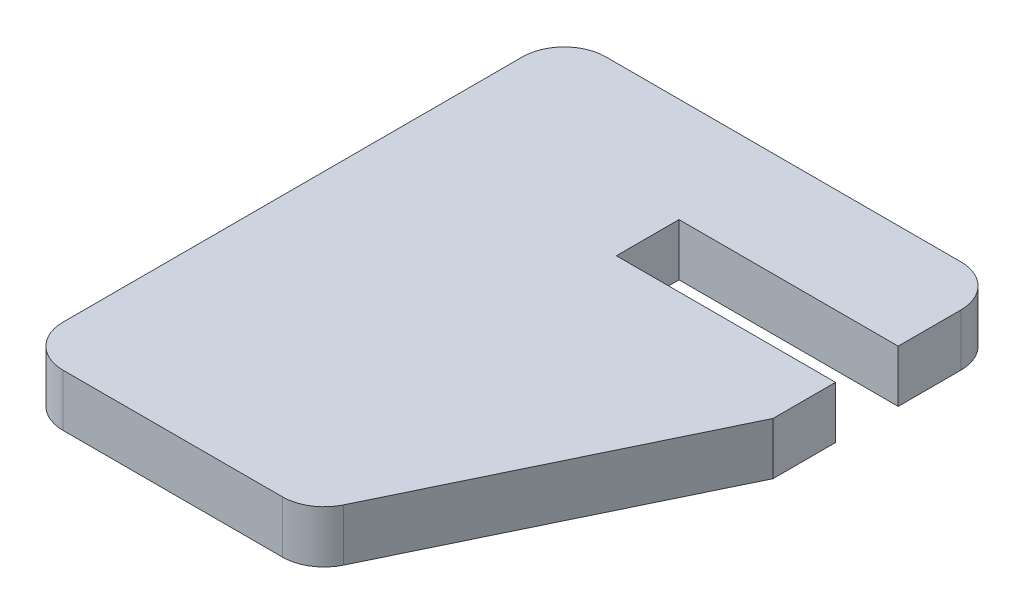
ISO-10303-21;
HEADER;
FILE_DESCRIPTION(('STEP AP214'),'2;1');
FILE_NAME('part.step','',(''),(''),'','','');
FILE_SCHEMA(('AUTOMOTIVE_DESIGN { 1 0 10303 214 1 1 1 1 }'));
ENDSEC;
DATA;
#1=APPLICATION_CONTEXT('core data for automotive mechanical design processes');
#2=APPLICATION_PROTOCOL_DEFINITION('international standard','automotive_design',2000,#1);
#3=PRODUCT_CONTEXT('',#1,'mechanical');
#4=PRODUCT('Part','Part','',(#3));
#5=PRODUCT_RELATED_PRODUCT_CATEGORY('part','',(#4));
#6=PRODUCT_DEFINITION_FORMATION('','',#4);
#7=PRODUCT_DEFINITION_CONTEXT('part definition',#1,'design');
#8=PRODUCT_DEFINITION('design','',#6,#7);
#9=PRODUCT_DEFINITION_SHAPE('','',#8);
#10=(LENGTH_UNIT() NAMED_UNIT(*) SI_UNIT(.MILLI.,.METRE.));
#11=(NAMED_UNIT(*) PLANE_ANGLE_UNIT() SI_UNIT($,.RADIAN.));
#12=(NAMED_UNIT(*) SI_UNIT($,.STERADIAN.) SOLID_ANGLE_UNIT());
#13=UNCERTAINTY_MEASURE_WITH_UNIT(LENGTH_MEASURE(1.E-05),#10,'distance_accuracy_value','');
#14=(GEOMETRIC_REPRESENTATION_CONTEXT(3) GLOBAL_UNCERTAINTY_ASSIGNED_CONTEXT((#13)) GLOBAL_UNIT_ASSIGNED_CONTEXT((#10,
#11,#12)) REPRESENTATION_CONTEXT('',''));
#15=CARTESIAN_POINT('',(0.,0.,0.));
#16=DIRECTION('',(0.,0.,1.));
#17=DIRECTION('',(1.,0.,0.));
#18=AXIS2_PLACEMENT_3D('',#15,#16,#17);
#19=CARTESIAN_POINT('',(5.07999999999999,6.35,40.6400000000009));
#20=DIRECTION('',(0.,-1.,0.));
#21=DIRECTION('',(0.,0.,-1.));
#22=AXIS2_PLACEMENT_3D('',#19,#20,#21);
#23=CYLINDRICAL_SURFACE('',#22,5.07999999999999);
#24=CARTESIAN_POINT('',(5.07999999999999,0.,40.6400000000009));
#25=DIRECTION('',(0.,1.,0.));
#26=DIRECTION('',(0.,0.,-1.));
#27=AXIS2_PLACEMENT_3D('',#24,#25,#26);
#28=CIRCLE('',#27,5.07999999999999);
#29=CARTESIAN_POINT('',(5.08000000000001,0.,45.7200000000008));
#30=VERTEX_POINT('',#29);
#31=CARTESIAN_POINT('',(9.65437909107353,0.,42.849401713395));
#32=VERTEX_POINT('',#31);
#33=EDGE_CURVE('E159',#30,#32,#28,.T.);
#34=ORIENTED_EDGE('',*,*,#33,.T.);
#35=DIRECTION('',(0.,-1.,0.));
#36=VECTOR('',#35,1.);
#37=CARTESIAN_POINT('',(9.65437909107353,6.35,42.849401713395));
#38=LINE('',#37,#36);
#39=CARTESIAN_POINT('',(9.65437909107353,6.35,42.849401713395));
#40=VERTEX_POINT('',#39);
#41=EDGE_CURVE('E11',#40,#32,#38,.T.);
#42=ORIENTED_EDGE('',*,*,#41,.F.);
#43=CARTESIAN_POINT('',(5.07999999999999,6.35,40.6400000000009));
#44=DIRECTION('',(0.,1.,0.));
#45=DIRECTION('',(0.,0.,-1.));
#46=AXIS2_PLACEMENT_3D('',#43,#44,#45);
#47=CIRCLE('',#46,5.07999999999999);
#48=CARTESIAN_POINT('',(5.08000000000001,6.35,45.7200000000008));
#49=VERTEX_POINT('',#48);
#50=EDGE_CURVE('E183',#49,#40,#47,.T.);
#51=ORIENTED_EDGE('',*,*,#50,.F.);
#52=DIRECTION('',(0.,-1.,0.));
#53=VECTOR('',#52,1.);
#54=CARTESIAN_POINT('',(5.08000000000001,6.35,45.7200000000008));
#55=LINE('',#54,#53);
#56=EDGE_CURVE('E155',#49,#30,#55,.T.);
#57=ORIENTED_EDGE('',*,*,#56,.T.);
#58=EDGE_LOOP('',(#34,#42,#51,#57));
#59=FACE_BOUND('',#58,.T.);
#60=ADVANCED_FACE('F33',(#59),#23,.T.);
#61=CARTESIAN_POINT('',(26.67,6.35,7.62));
#62=DIRECTION('',(-0.900468325014477,0.,-0.43492159712484));
#63=DIRECTION('',(-0.43492159712484,0.,0.900468325014478));
#64=AXIS2_PLACEMENT_3D('',#61,#62,#63);
#65=PLANE('',#64);
#66=DIRECTION('',(0.43492159712484,0.,-0.900468325014477));
#67=VECTOR('',#66,1.);
#68=CARTESIAN_POINT('',(26.67,0.,7.62));
#69=LINE('',#68,#67);
#70=CARTESIAN_POINT('',(26.67,0.,7.62));
#71=VERTEX_POINT('',#70);
#72=EDGE_CURVE('E162',#32,#71,#69,.T.);
#73=ORIENTED_EDGE('',*,*,#72,.T.);
#74=DIRECTION('',(0.,-1.,0.));
#75=VECTOR('',#74,1.);
#76=CARTESIAN_POINT('',(26.67,6.35,7.62));
#77=LINE('',#76,#75);
#78=CARTESIAN_POINT('',(26.67,6.35,7.62));
#79=VERTEX_POINT('',#78);
#80=EDGE_CURVE('E41',#79,#71,#77,.T.);
#81=ORIENTED_EDGE('',*,*,#80,.F.);
#82=DIRECTION('',(0.43492159712484,0.,-0.900468325014477));
#83=VECTOR('',#82,1.);
#84=CARTESIAN_POINT('',(26.67,6.35,7.62));
#85=LINE('',#84,#83);
#86=EDGE_CURVE('E107',#40,#79,#85,.T.);
#87=ORIENTED_EDGE('',*,*,#86,.F.);
#88=ORIENTED_EDGE('',*,*,#41,.T.);
#89=EDGE_LOOP('',(#73,#81,#87,#88));
#90=FACE_BOUND('',#89,.T.);
#91=ADVANCED_FACE('F266',(#90),#65,.F.);
#92=CARTESIAN_POINT('',(26.67,6.35,7.62));
#93=DIRECTION('',(-1.,0.,0.));
#94=DIRECTION('',(0.,0.,1.));
#95=AXIS2_PLACEMENT_3D('',#92,#93,#94);
#96=PLANE('',#95);
#97=DIRECTION('',(0.,0.,-1.));
#98=VECTOR('',#97,1.);
#99=CARTESIAN_POINT('',(26.67,0.,7.62));
#100=LINE('',#99,#98);
#101=CARTESIAN_POINT('',(26.67,0.,0.));
#102=VERTEX_POINT('',#101);
#103=EDGE_CURVE('E164',#71,#102,#100,.T.);
#104=ORIENTED_EDGE('',*,*,#103,.T.);
#105=DIRECTION('',(0.,-1.,0.));
#106=VECTOR('',#105,1.);
#107=CARTESIAN_POINT('',(26.67,6.35,0.));
#108=LINE('',#107,#106);
#109=CARTESIAN_POINT('',(26.67,6.35,0.));
#110=VERTEX_POINT('',#109);
#111=EDGE_CURVE('E205',#110,#102,#108,.T.);
#112=ORIENTED_EDGE('',*,*,#111,.F.);
#113=DIRECTION('',(0.,0.,-1.));
#114=VECTOR('',#113,1.);
#115=CARTESIAN_POINT('',(26.67,6.35,7.62));
#116=LINE('',#115,#114);
#117=EDGE_CURVE('E213',#79,#110,#116,.T.);
#118=ORIENTED_EDGE('',*,*,#117,.F.);
#119=ORIENTED_EDGE('',*,*,#80,.T.);
#120=EDGE_LOOP('',(#104,#112,#118,#119));
#121=FACE_BOUND('',#120,.T.);
#122=ADVANCED_FACE('F211',(#121),#96,.F.);
#123=CARTESIAN_POINT('',(26.67,6.35,0.));
#124=DIRECTION('',(0.,0.,1.));
#125=DIRECTION('',(1.,0.,0.));
#126=AXIS2_PLACEMENT_3D('',#123,#124,#125);
#127=PLANE('',#126);
#128=DIRECTION('',(-1.,0.,0.));
#129=VECTOR('',#128,1.);
#130=CARTESIAN_POINT('',(26.67,0.,0.));
#131=LINE('',#130,#129);
#132=CARTESIAN_POINT('',(0.,0.,0.));
#133=VERTEX_POINT('',#132);
#134=EDGE_CURVE('E166',#102,#133,#131,.T.);
#135=ORIENTED_EDGE('',*,*,#134,.T.);
#136=DIRECTION('',(0.,-1.,0.));
#137=VECTOR('',#136,1.);
#138=CARTESIAN_POINT('',(0.,6.35,0.));
#139=LINE('',#138,#137);
#140=CARTESIAN_POINT('',(0.,6.35,0.));
#141=VERTEX_POINT('',#140);
#142=EDGE_CURVE('E202',#141,#133,#139,.T.);
#143=ORIENTED_EDGE('',*,*,#142,.F.);
#144=DIRECTION('',(-1.,0.,0.));
#145=VECTOR('',#144,1.);
#146=CARTESIAN_POINT('',(26.67,6.35,0.));
#147=LINE('',#146,#145);
#148=EDGE_CURVE('E231',#110,#141,#147,.T.);
#149=ORIENTED_EDGE('',*,*,#148,.F.);
#150=ORIENTED_EDGE('',*,*,#111,.T.);
#151=EDGE_LOOP('',(#135,#143,#149,#150));
#152=FACE_BOUND('',#151,.T.);
#153=ADVANCED_FACE('F222',(#152),#127,.F.);
#154=CARTESIAN_POINT('',(0.,6.35,-7.62));
#155=DIRECTION('',(-1.,0.,0.));
#156=DIRECTION('',(0.,0.,1.));
#157=AXIS2_PLACEMENT_3D('',#154,#155,#156);
#158=PLANE('',#157);
#159=DIRECTION('',(0.,0.,-1.));
#160=VECTOR('',#159,1.);
#161=CARTESIAN_POINT('',(0.,0.,-7.62));
#162=LINE('',#161,#160);
#163=CARTESIAN_POINT('',(0.,0.,-7.62));
#164=VERTEX_POINT('',#163);
#165=EDGE_CURVE('E168',#133,#164,#162,.T.);
#166=ORIENTED_EDGE('',*,*,#165,.T.);
#167=DIRECTION('',(0.,-1.,0.));
#168=VECTOR('',#167,1.);
#169=CARTESIAN_POINT('',(0.,6.35,-7.62));
#170=LINE('',#169,#168);
#171=CARTESIAN_POINT('',(0.,6.35,-7.62));
#172=VERTEX_POINT('',#171);
#173=EDGE_CURVE('E199',#172,#164,#170,.T.);
#174=ORIENTED_EDGE('',*,*,#173,.F.);
#175=DIRECTION('',(0.,0.,-1.));
#176=VECTOR('',#175,1.);
#177=CARTESIAN_POINT('',(0.,6.35,-7.62));
#178=LINE('',#177,#176);
#179=EDGE_CURVE('E228',#141,#172,#178,.T.);
#180=ORIENTED_EDGE('',*,*,#179,.F.);
#181=ORIENTED_EDGE('',*,*,#142,.T.);
#182=EDGE_LOOP('',(#166,#174,#180,#181));
#183=FACE_BOUND('',#182,.T.);
#184=ADVANCED_FACE('F226',(#183),#158,.F.);
#185=CARTESIAN_POINT('',(26.67,6.35,-7.62));
#186=DIRECTION('',(0.,0.,-1.));
#187=DIRECTION('',(-1.,0.,0.));
#188=AXIS2_PLACEMENT_3D('',#185,#186,#187);
#189=PLANE('',#188);
#190=DIRECTION('',(1.,0.,0.));
#191=VECTOR('',#190,1.);
#192=CARTESIAN_POINT('',(26.67,0.,-7.62));
#193=LINE('',#192,#191);
#194=CARTESIAN_POINT('',(26.67,0.,-7.62));
#195=VERTEX_POINT('',#194);
#196=EDGE_CURVE('E170',#164,#195,#193,.T.);
#197=ORIENTED_EDGE('',*,*,#196,.T.);
#198=DIRECTION('',(0.,-1.,0.));
#199=VECTOR('',#198,1.);
#200=CARTESIAN_POINT('',(26.67,6.35,-7.62));
#201=LINE('',#200,#199);
#202=CARTESIAN_POINT('',(26.67,6.35,-7.62));
#203=VERTEX_POINT('',#202);
#204=EDGE_CURVE('E196',#203,#195,#201,.T.);
#205=ORIENTED_EDGE('',*,*,#204,.F.);
#206=DIRECTION('',(1.,0.,0.));
#207=VECTOR('',#206,1.);
#208=CARTESIAN_POINT('',(26.67,6.35,-7.62));
#209=LINE('',#208,#207);
#210=EDGE_CURVE('E230',#172,#203,#209,.T.);
#211=ORIENTED_EDGE('',*,*,#210,.F.);
#212=ORIENTED_EDGE('',*,*,#173,.T.);
#213=EDGE_LOOP('',(#197,#205,#211,#212));
#214=FACE_BOUND('',#213,.T.);
#215=ADVANCED_FACE('F279',(#214),#189,.F.);
#216=CARTESIAN_POINT('',(26.67,6.35,-7.62));
#217=DIRECTION('',(-1.,0.,0.));
#218=DIRECTION('',(0.,0.,1.));
#219=AXIS2_PLACEMENT_3D('',#216,#217,#218);
#220=PLANE('',#219);
#221=DIRECTION('',(0.,0.,-1.));
#222=VECTOR('',#221,1.);
#223=CARTESIAN_POINT('',(26.67,0.,-7.62));
#224=LINE('',#223,#222);
#225=CARTESIAN_POINT('',(26.67,0.,-15.24));
#226=VERTEX_POINT('',#225);
#227=EDGE_CURVE('E172',#195,#226,#224,.T.);
#228=ORIENTED_EDGE('',*,*,#227,.T.);
#229=DIRECTION('',(0.,-1.,0.));
#230=VECTOR('',#229,1.);
#231=CARTESIAN_POINT('',(26.67,6.35,-15.24));
#232=LINE('',#231,#230);
#233=CARTESIAN_POINT('',(26.67,6.35,-15.24));
#234=VERTEX_POINT('',#233);
#235=EDGE_CURVE('E193',#234,#226,#232,.T.);
#236=ORIENTED_EDGE('',*,*,#235,.F.);
#237=DIRECTION('',(0.,0.,-1.));
#238=VECTOR('',#237,1.);
#239=CARTESIAN_POINT('',(26.67,6.35,-7.62));
#240=LINE('',#239,#238);
#241=EDGE_CURVE('E233',#203,#234,#240,.T.);
#242=ORIENTED_EDGE('',*,*,#241,.F.);
#243=ORIENTED_EDGE('',*,*,#204,.T.);
#244=EDGE_LOOP('',(#228,#236,#242,#243));
#245=FACE_BOUND('',#244,.T.);
#246=ADVANCED_FACE('F282',(#245),#220,.F.);
#247=CARTESIAN_POINT('',(21.59,6.35,-15.24));
#248=DIRECTION('',(0.,-1.,0.));
#249=DIRECTION('',(0.,0.,-1.));
#250=AXIS2_PLACEMENT_3D('',#247,#248,#249);
#251=CYLINDRICAL_SURFACE('',#250,5.08);
#252=CARTESIAN_POINT('',(21.59,0.,-15.24));
#253=DIRECTION('',(0.,1.,0.));
#254=DIRECTION('',(0.,0.,-1.));
#255=AXIS2_PLACEMENT_3D('',#252,#253,#254);
#256=CIRCLE('',#255,5.08);
#257=CARTESIAN_POINT('',(21.59,0.,-20.32));
#258=VERTEX_POINT('',#257);
#259=EDGE_CURVE('E174',#226,#258,#256,.T.);
#260=ORIENTED_EDGE('',*,*,#259,.T.);
#261=DIRECTION('',(0.,-1.,0.));
#262=VECTOR('',#261,1.);
#263=CARTESIAN_POINT('',(21.59,6.35,-20.32));
#264=LINE('',#263,#262);
#265=CARTESIAN_POINT('',(21.59,6.35,-20.32));
#266=VERTEX_POINT('',#265);
#267=EDGE_CURVE('E190',#266,#258,#264,.T.);
#268=ORIENTED_EDGE('',*,*,#267,.F.);
#269=CARTESIAN_POINT('',(21.59,6.35,-15.24));
#270=DIRECTION('',(0.,1.,0.));
#271=DIRECTION('',(0.,0.,-1.));
#272=AXIS2_PLACEMENT_3D('',#269,#270,#271);
#273=CIRCLE('',#272,5.08);
#274=EDGE_CURVE('E239',#234,#266,#273,.T.);
#275=ORIENTED_EDGE('',*,*,#274,.F.);
#276=ORIENTED_EDGE('',*,*,#235,.T.);
#277=EDGE_LOOP('',(#260,#268,#275,#276));
#278=FACE_BOUND('',#277,.T.);
#279=ADVANCED_FACE('F286',(#278),#251,.T.);
#280=CARTESIAN_POINT('',(-21.59,6.35,-20.32));
#281=DIRECTION('',(0.,0.,1.));
#282=DIRECTION('',(1.,0.,0.));
#283=AXIS2_PLACEMENT_3D('',#280,#281,#282);
#284=PLANE('',#283);
#285=DIRECTION('',(-1.,0.,0.));
#286=VECTOR('',#285,1.);
#287=CARTESIAN_POINT('',(-21.59,0.,-20.32));
#288=LINE('',#287,#286);
#289=CARTESIAN_POINT('',(-21.59,0.,-20.32));
#290=VERTEX_POINT('',#289);
#291=EDGE_CURVE('E176',#258,#290,#288,.T.);
#292=ORIENTED_EDGE('',*,*,#291,.T.);
#293=DIRECTION('',(0.,-1.,0.));
#294=VECTOR('',#293,1.);
#295=CARTESIAN_POINT('',(-21.59,6.35,-20.32));
#296=LINE('',#295,#294);
#297=CARTESIAN_POINT('',(-21.59,6.35,-20.32));
#298=VERTEX_POINT('',#297);
#299=EDGE_CURVE('E187',#298,#290,#296,.T.);
#300=ORIENTED_EDGE('',*,*,#299,.F.);
#301=DIRECTION('',(-1.,0.,0.));
#302=VECTOR('',#301,1.);
#303=CARTESIAN_POINT('',(-21.59,6.35,-20.32));
#304=LINE('',#303,#302);
#305=EDGE_CURVE('E241',#266,#298,#304,.T.);
#306=ORIENTED_EDGE('',*,*,#305,.F.);
#307=ORIENTED_EDGE('',*,*,#267,.T.);
#308=EDGE_LOOP('',(#292,#300,#306,#307));
#309=FACE_BOUND('',#308,.T.);
#310=ADVANCED_FACE('F247',(#309),#284,.F.);
#311=CARTESIAN_POINT('',(-21.59,6.35,-15.24));
#312=DIRECTION('',(0.,-1.,0.));
#313=DIRECTION('',(0.,0.,-1.));
#314=AXIS2_PLACEMENT_3D('',#311,#312,#313);
#315=CYLINDRICAL_SURFACE('',#314,5.08);
#316=CARTESIAN_POINT('',(-21.59,0.,-15.24));
#317=DIRECTION('',(0.,1.,0.));
#318=DIRECTION('',(0.,0.,-1.));
#319=AXIS2_PLACEMENT_3D('',#316,#317,#318);
#320=CIRCLE('',#319,5.08);
#321=CARTESIAN_POINT('',(-26.67,0.,-15.24));
#322=VERTEX_POINT('',#321);
#323=EDGE_CURVE('E178',#290,#322,#320,.T.);
#324=ORIENTED_EDGE('',*,*,#323,.T.);
#325=DIRECTION('',(0.,-1.,0.));
#326=VECTOR('',#325,1.);
#327=CARTESIAN_POINT('',(-26.67,6.35,-15.24));
#328=LINE('',#327,#326);
#329=CARTESIAN_POINT('',(-26.67,6.35,-15.24));
#330=VERTEX_POINT('',#329);
#331=EDGE_CURVE('E150',#330,#322,#328,.T.);
#332=ORIENTED_EDGE('',*,*,#331,.F.);
#333=CARTESIAN_POINT('',(-21.59,6.35,-15.24));
#334=DIRECTION('',(0.,1.,0.));
#335=DIRECTION('',(0.,0.,-1.));
#336=AXIS2_PLACEMENT_3D('',#333,#334,#335);
#337=CIRCLE('',#336,5.08);
#338=EDGE_CURVE('E141',#298,#330,#337,.T.);
#339=ORIENTED_EDGE('',*,*,#338,.F.);
#340=ORIENTED_EDGE('',*,*,#299,.T.);
#341=EDGE_LOOP('',(#324,#332,#339,#340));
#342=FACE_BOUND('',#341,.T.);
#343=ADVANCED_FACE('F251',(#342),#315,.T.);
#344=CARTESIAN_POINT('',(-26.67,6.35,40.6400000000009));
#345=DIRECTION('',(1.,0.,0.));
#346=DIRECTION('',(0.,0.,-1.));
#347=AXIS2_PLACEMENT_3D('',#344,#345,#346);
#348=PLANE('',#347);
#349=DIRECTION('',(0.,0.,1.));
#350=VECTOR('',#349,1.);
#351=CARTESIAN_POINT('',(-26.67,0.,40.6400000000009));
#352=LINE('',#351,#350);
#353=CARTESIAN_POINT('',(-26.67,0.,40.6400000000009));
#354=VERTEX_POINT('',#353);
#355=EDGE_CURVE('E149',#322,#354,#352,.T.);
#356=ORIENTED_EDGE('',*,*,#355,.T.);
#357=DIRECTION('',(0.,-1.,0.));
#358=VECTOR('',#357,1.);
#359=CARTESIAN_POINT('',(-26.67,6.35,40.6400000000009));
#360=LINE('',#359,#358);
#361=CARTESIAN_POINT('',(-26.67,6.35,40.6400000000009));
#362=VERTEX_POINT('',#361);
#363=EDGE_CURVE('E146',#362,#354,#360,.T.);
#364=ORIENTED_EDGE('',*,*,#363,.F.);
#365=DIRECTION('',(0.,0.,1.));
#366=VECTOR('',#365,1.);
#367=CARTESIAN_POINT('',(-26.67,6.35,40.6400000000009));
#368=LINE('',#367,#366);
#369=EDGE_CURVE('E135',#330,#362,#368,.T.);
#370=ORIENTED_EDGE('',*,*,#369,.F.);
#371=ORIENTED_EDGE('',*,*,#331,.T.);
#372=EDGE_LOOP('',(#356,#364,#370,#371));
#373=FACE_BOUND('',#372,.T.);
#374=ADVANCED_FACE('F147',(#373),#348,.F.);
#375=CARTESIAN_POINT('',(-21.59,6.35,40.6400000000009));
#376=DIRECTION('',(0.,-1.,0.));
#377=DIRECTION('',(0.,0.,-1.));
#378=AXIS2_PLACEMENT_3D('',#375,#376,#377);
#379=CYLINDRICAL_SURFACE('',#378,5.08);
#380=CARTESIAN_POINT('',(-21.59,0.,40.6400000000009));
#381=DIRECTION('',(0.,1.,0.));
#382=DIRECTION('',(0.,0.,-1.));
#383=AXIS2_PLACEMENT_3D('',#380,#381,#382);
#384=CIRCLE('',#383,5.08);
#385=CARTESIAN_POINT('',(-21.59,0.,45.7200000000009));
#386=VERTEX_POINT('',#385);
#387=EDGE_CURVE('E93',#354,#386,#384,.T.);
#388=ORIENTED_EDGE('',*,*,#387,.T.);
#389=DIRECTION('',(0.,-1.,0.));
#390=VECTOR('',#389,1.);
#391=CARTESIAN_POINT('',(-21.59,6.35,45.7200000000009));
#392=LINE('',#391,#390);
#393=CARTESIAN_POINT('',(-21.59,6.35,45.7200000000009));
#394=VERTEX_POINT('',#393);
#395=EDGE_CURVE('E151',#394,#386,#392,.T.);
#396=ORIENTED_EDGE('',*,*,#395,.F.);
#397=CARTESIAN_POINT('',(-21.59,6.35,40.6400000000009));
#398=DIRECTION('',(0.,1.,0.));
#399=DIRECTION('',(0.,0.,-1.));
#400=AXIS2_PLACEMENT_3D('',#397,#398,#399);
#401=CIRCLE('',#400,5.08);
#402=EDGE_CURVE('E139',#362,#394,#401,.T.);
#403=ORIENTED_EDGE('',*,*,#402,.F.);
#404=ORIENTED_EDGE('',*,*,#363,.T.);
#405=EDGE_LOOP('',(#388,#396,#403,#404));
#406=FACE_BOUND('',#405,.T.);
#407=ADVANCED_FACE('F153',(#406),#379,.T.);
#408=CARTESIAN_POINT('',(-21.59,6.35,45.7200000000009));
#409=DIRECTION('',(0.,0.,-1.));
#410=DIRECTION('',(-1.,0.,0.));
#411=AXIS2_PLACEMENT_3D('',#408,#409,#410);
#412=PLANE('',#411);
#413=DIRECTION('',(1.,0.,0.));
#414=VECTOR('',#413,1.);
#415=CARTESIAN_POINT('',(-21.59,0.,45.7200000000009));
#416=LINE('',#415,#414);
#417=EDGE_CURVE('E99',#386,#30,#416,.T.);
#418=ORIENTED_EDGE('',*,*,#417,.T.);
#419=ORIENTED_EDGE('',*,*,#56,.F.);
#420=DIRECTION('',(1.,0.,0.));
#421=VECTOR('',#420,1.);
#422=CARTESIAN_POINT('',(-21.59,6.35,45.7200000000009));
#423=LINE('',#422,#421);
#424=EDGE_CURVE('E49',#394,#49,#423,.T.);
#425=ORIENTED_EDGE('',*,*,#424,.F.);
#426=ORIENTED_EDGE('',*,*,#395,.T.);
#427=EDGE_LOOP('',(#418,#419,#425,#426));
#428=FACE_BOUND('',#427,.T.);
#429=ADVANCED_FACE('F255',(#428),#412,.F.);
#430=CARTESIAN_POINT('',(5.07999999999999,6.35,40.6400000000009));
#431=DIRECTION('',(0.,-1.,0.));
#432=DIRECTION('',(0.,0.,-1.));
#433=AXIS2_PLACEMENT_3D('',#430,#431,#432);
#434=PLANE('',#433);
#435=ORIENTED_EDGE('',*,*,#50,.T.);
#436=ORIENTED_EDGE('',*,*,#86,.T.);
#437=ORIENTED_EDGE('',*,*,#117,.T.);
#438=ORIENTED_EDGE('',*,*,#148,.T.);
#439=ORIENTED_EDGE('',*,*,#179,.T.);
#440=ORIENTED_EDGE('',*,*,#210,.T.);
#441=ORIENTED_EDGE('',*,*,#241,.T.);
#442=ORIENTED_EDGE('',*,*,#274,.T.);
#443=ORIENTED_EDGE('',*,*,#305,.T.);
#444=ORIENTED_EDGE('',*,*,#338,.T.);
#445=ORIENTED_EDGE('',*,*,#369,.T.);
#446=ORIENTED_EDGE('',*,*,#402,.T.);
#447=ORIENTED_EDGE('',*,*,#424,.T.);
#448=EDGE_LOOP('',(#435,#436,#437,#438,#439,#440,#441,#442,#443,#444,#445,#446,#447));
#449=FACE_BOUND('',#448,.T.);
#450=ADVANCED_FACE('F137',(#449),#434,.F.);
#451=CARTESIAN_POINT('',(5.07999999999999,0.,40.6400000000009));
#452=DIRECTION('',(0.,-1.,0.));
#453=DIRECTION('',(0.,0.,-1.));
#454=AXIS2_PLACEMENT_3D('',#451,#452,#453);
#455=PLANE('',#454);
#456=ORIENTED_EDGE('',*,*,#33,.F.);
#457=ORIENTED_EDGE('',*,*,#417,.F.);
#458=ORIENTED_EDGE('',*,*,#387,.F.);
#459=ORIENTED_EDGE('',*,*,#355,.F.);
#460=ORIENTED_EDGE('',*,*,#323,.F.);
#461=ORIENTED_EDGE('',*,*,#291,.F.);
#462=ORIENTED_EDGE('',*,*,#259,.F.);
#463=ORIENTED_EDGE('',*,*,#227,.F.);
#464=ORIENTED_EDGE('',*,*,#196,.F.);
#465=ORIENTED_EDGE('',*,*,#165,.F.);
#466=ORIENTED_EDGE('',*,*,#134,.F.);
#467=ORIENTED_EDGE('',*,*,#103,.F.);
#468=ORIENTED_EDGE('',*,*,#72,.F.);
#469=EDGE_LOOP('',(#456,#457,#458,#459,#460,#461,#462,#463,#464,#465,#466,#467,#468));
#470=FACE_BOUND('',#469,.T.);
#471=ADVANCED_FACE('F217',(#470),#455,.T.);
#472=CLOSED_SHELL('',(#60,#91,#122,#153,#184,#215,#246,#279,#310,#343,#374,#407,#429,#450,#471));
#473=MANIFOLD_SOLID_BREP('B2',#472);
#474=ADVANCED_BREP_SHAPE_REPRESENTATION('',(#18,#473),#14);
#475=SHAPE_DEFINITION_REPRESENTATION(#9,#474);
ENDSEC;
END-ISO-10303-21;
